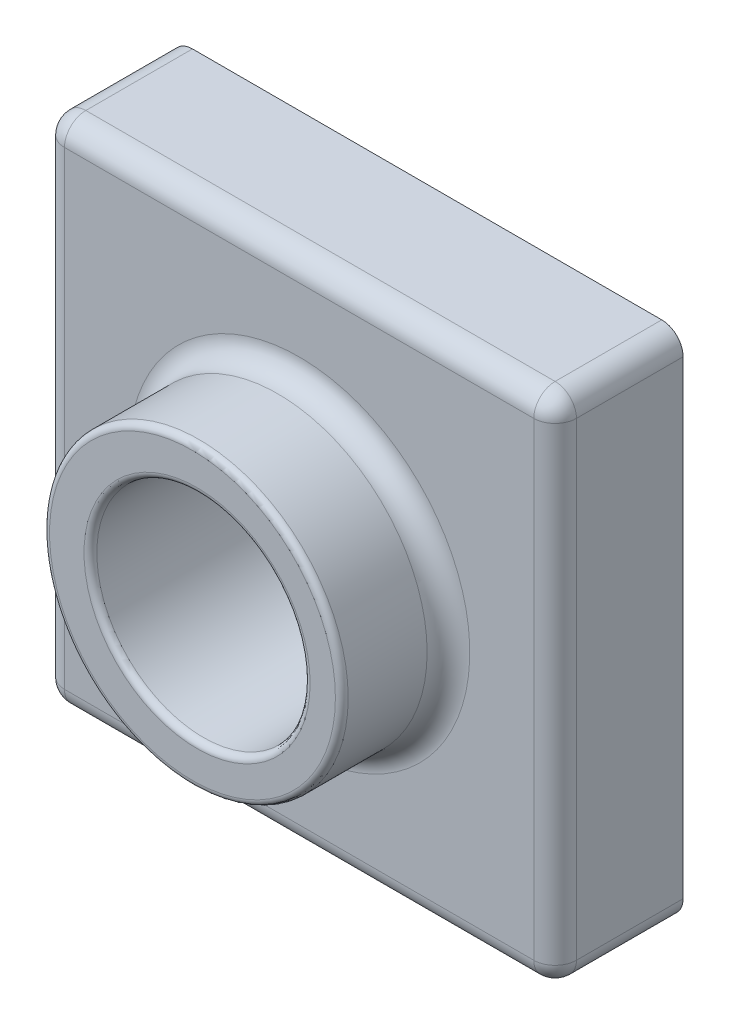
ISO-10303-21;
HEADER;
FILE_DESCRIPTION(('STEP AP214'),'2;1');
FILE_NAME('part.step','',(''),(''),'','','');
FILE_SCHEMA(('AUTOMOTIVE_DESIGN { 1 0 10303 214 1 1 1 1 }'));
ENDSEC;
DATA;
#1=APPLICATION_CONTEXT('core data for automotive mechanical design processes');
#2=APPLICATION_PROTOCOL_DEFINITION('international standard','automotive_design',2000,#1);
#3=PRODUCT_CONTEXT('',#1,'mechanical');
#4=PRODUCT('Part','Part','',(#3));
#5=PRODUCT_RELATED_PRODUCT_CATEGORY('part','',(#4));
#6=PRODUCT_DEFINITION_FORMATION('','',#4);
#7=PRODUCT_DEFINITION_CONTEXT('part definition',#1,'design');
#8=PRODUCT_DEFINITION('design','',#6,#7);
#9=PRODUCT_DEFINITION_SHAPE('','',#8);
#10=(LENGTH_UNIT() NAMED_UNIT(*) SI_UNIT(.MILLI.,.METRE.));
#11=(NAMED_UNIT(*) PLANE_ANGLE_UNIT() SI_UNIT($,.RADIAN.));
#12=(NAMED_UNIT(*) SI_UNIT($,.STERADIAN.) SOLID_ANGLE_UNIT());
#13=UNCERTAINTY_MEASURE_WITH_UNIT(LENGTH_MEASURE(1.E-05),#10,'distance_accuracy_value','');
#14=(GEOMETRIC_REPRESENTATION_CONTEXT(3) GLOBAL_UNCERTAINTY_ASSIGNED_CONTEXT((#13)) GLOBAL_UNIT_ASSIGNED_CONTEXT((#10,
#11,#12)) REPRESENTATION_CONTEXT('',''));
#15=CARTESIAN_POINT('',(0.,0.,0.));
#16=DIRECTION('',(0.,0.,1.));
#17=DIRECTION('',(1.,0.,0.));
#18=AXIS2_PLACEMENT_3D('',#15,#16,#17);
#19=CARTESIAN_POINT('',(0.,0.,0.));
#20=DIRECTION('',(0.,0.,-1.));
#21=DIRECTION('',(-1.,0.,0.));
#22=AXIS2_PLACEMENT_3D('',#19,#20,#21);
#23=PLANE('',#22);
#24=DIRECTION('',(0.,1.,0.));
#25=VECTOR('',#24,1.);
#26=CARTESIAN_POINT('',(120.,0.,0.));
#27=LINE('',#26,#25);
#28=CARTESIAN_POINT('',(120.,5.,0.));
#29=VERTEX_POINT('',#28);
#30=CARTESIAN_POINT('',(120.,115.,0.));
#31=VERTEX_POINT('',#30);
#32=EDGE_CURVE('E289',#29,#31,#27,.T.);
#33=ORIENTED_EDGE('',*,*,#32,.F.);
#34=CARTESIAN_POINT('',(115.,5.,0.));
#35=DIRECTION('',(0.,0.,-1.));
#36=DIRECTION('',(-1.,0.,0.));
#37=AXIS2_PLACEMENT_3D('',#34,#35,#36);
#38=CIRCLE('',#37,5.);
#39=CARTESIAN_POINT('',(115.,0.,0.));
#40=VERTEX_POINT('',#39);
#41=EDGE_CURVE('E372',#29,#40,#38,.T.);
#42=ORIENTED_EDGE('',*,*,#41,.T.);
#43=DIRECTION('',(1.,0.,0.));
#44=VECTOR('',#43,1.);
#45=CARTESIAN_POINT('',(0.,0.,0.));
#46=LINE('',#45,#44);
#47=CARTESIAN_POINT('',(5.,0.,0.));
#48=VERTEX_POINT('',#47);
#49=EDGE_CURVE('E302',#48,#40,#46,.T.);
#50=ORIENTED_EDGE('',*,*,#49,.F.);
#51=CARTESIAN_POINT('',(5.,5.,0.));
#52=DIRECTION('',(0.,0.,-1.));
#53=DIRECTION('',(-1.,0.,0.));
#54=AXIS2_PLACEMENT_3D('',#51,#52,#53);
#55=CIRCLE('',#54,5.);
#56=CARTESIAN_POINT('',(0.,5.,0.));
#57=VERTEX_POINT('',#56);
#58=EDGE_CURVE('E363',#48,#57,#55,.T.);
#59=ORIENTED_EDGE('',*,*,#58,.T.);
#60=DIRECTION('',(0.,-1.,0.));
#61=VECTOR('',#60,1.);
#62=CARTESIAN_POINT('',(0.,0.,0.));
#63=LINE('',#62,#61);
#64=CARTESIAN_POINT('',(0.,115.,0.));
#65=VERTEX_POINT('',#64);
#66=EDGE_CURVE('E298',#65,#57,#63,.T.);
#67=ORIENTED_EDGE('',*,*,#66,.F.);
#68=CARTESIAN_POINT('',(4.99999999999996,115.,0.));
#69=DIRECTION('',(0.,0.,-1.));
#70=DIRECTION('',(-1.,0.,0.));
#71=AXIS2_PLACEMENT_3D('',#68,#69,#70);
#72=CIRCLE('',#71,5.);
#73=CARTESIAN_POINT('',(4.99999999999996,120.,0.));
#74=VERTEX_POINT('',#73);
#75=EDGE_CURVE('E366',#65,#74,#72,.T.);
#76=ORIENTED_EDGE('',*,*,#75,.T.);
#77=DIRECTION('',(-1.,0.,0.));
#78=VECTOR('',#77,1.);
#79=CARTESIAN_POINT('',(0.,120.,0.));
#80=LINE('',#79,#78);
#81=CARTESIAN_POINT('',(115.,120.,0.));
#82=VERTEX_POINT('',#81);
#83=EDGE_CURVE('E294',#82,#74,#80,.T.);
#84=ORIENTED_EDGE('',*,*,#83,.F.);
#85=CARTESIAN_POINT('',(115.,115.,0.));
#86=DIRECTION('',(0.,0.,-1.));
#87=DIRECTION('',(-1.,0.,0.));
#88=AXIS2_PLACEMENT_3D('',#85,#86,#87);
#89=CIRCLE('',#88,5.);
#90=EDGE_CURVE('E369',#82,#31,#89,.T.);
#91=ORIENTED_EDGE('',*,*,#90,.T.);
#92=EDGE_LOOP('',(#33,#42,#50,#59,#67,#76,#84,#91));
#93=FACE_BOUND('',#92,.T.);
#94=CARTESIAN_POINT('',(115.,5.,0.));
#95=DIRECTION('',(0.,0.,-1.));
#96=DIRECTION('',(-1.,0.,0.));
#97=AXIS2_PLACEMENT_3D('',#94,#95,#96);
#98=CIRCLE('',#97,3.);
#99=CARTESIAN_POINT('',(118.,5.,0.));
#100=VERTEX_POINT('',#99);
#101=CARTESIAN_POINT('',(115.,2.,0.));
#102=VERTEX_POINT('',#101);
#103=EDGE_CURVE('E252',#100,#102,#98,.T.);
#104=ORIENTED_EDGE('',*,*,#103,.F.);
#105=DIRECTION('',(0.,1.,0.));
#106=VECTOR('',#105,1.);
#107=CARTESIAN_POINT('',(118.,0.,0.));
#108=LINE('',#107,#106);
#109=CARTESIAN_POINT('',(118.,115.,0.));
#110=VERTEX_POINT('',#109);
#111=EDGE_CURVE('E196',#100,#110,#108,.T.);
#112=ORIENTED_EDGE('',*,*,#111,.T.);
#113=CARTESIAN_POINT('',(115.,115.,0.));
#114=DIRECTION('',(0.,0.,-1.));
#115=DIRECTION('',(-1.,0.,0.));
#116=AXIS2_PLACEMENT_3D('',#113,#114,#115);
#117=CIRCLE('',#116,3.);
#118=CARTESIAN_POINT('',(115.,118.,0.));
#119=VERTEX_POINT('',#118);
#120=EDGE_CURVE('E262',#119,#110,#117,.T.);
#121=ORIENTED_EDGE('',*,*,#120,.F.);
#122=DIRECTION('',(-1.,0.,0.));
#123=VECTOR('',#122,1.);
#124=CARTESIAN_POINT('',(0.,118.,0.));
#125=LINE('',#124,#123);
#126=CARTESIAN_POINT('',(4.99999999999996,118.,0.));
#127=VERTEX_POINT('',#126);
#128=EDGE_CURVE('E54',#119,#127,#125,.T.);
#129=ORIENTED_EDGE('',*,*,#128,.T.);
#130=CARTESIAN_POINT('',(4.99999999999996,115.,0.));
#131=DIRECTION('',(0.,0.,-1.));
#132=DIRECTION('',(-1.,0.,0.));
#133=AXIS2_PLACEMENT_3D('',#130,#131,#132);
#134=CIRCLE('',#133,3.);
#135=CARTESIAN_POINT('',(1.99999999999996,115.,0.));
#136=VERTEX_POINT('',#135);
#137=EDGE_CURVE('E271',#136,#127,#134,.T.);
#138=ORIENTED_EDGE('',*,*,#137,.F.);
#139=DIRECTION('',(0.,-1.,0.));
#140=VECTOR('',#139,1.);
#141=CARTESIAN_POINT('',(2.,0.,0.));
#142=LINE('',#141,#140);
#143=CARTESIAN_POINT('',(2.,5.,0.));
#144=VERTEX_POINT('',#143);
#145=EDGE_CURVE('E268',#136,#144,#142,.T.);
#146=ORIENTED_EDGE('',*,*,#145,.T.);
#147=CARTESIAN_POINT('',(5.,5.,0.));
#148=DIRECTION('',(0.,0.,-1.));
#149=DIRECTION('',(-1.,0.,0.));
#150=AXIS2_PLACEMENT_3D('',#147,#148,#149);
#151=CIRCLE('',#150,3.);
#152=CARTESIAN_POINT('',(5.,2.,0.));
#153=VERTEX_POINT('',#152);
#154=EDGE_CURVE('E246',#153,#144,#151,.T.);
#155=ORIENTED_EDGE('',*,*,#154,.F.);
#156=DIRECTION('',(1.,0.,0.));
#157=VECTOR('',#156,1.);
#158=CARTESIAN_POINT('',(0.,2.,0.));
#159=LINE('',#158,#157);
#160=EDGE_CURVE('E263',#153,#102,#159,.T.);
#161=ORIENTED_EDGE('',*,*,#160,.T.);
#162=EDGE_LOOP('',(#104,#112,#121,#129,#138,#146,#155,#161));
#163=FACE_BOUND('',#162,.T.);
#164=ADVANCED_FACE('F38',(#93,#163),#23,.T.);
#165=CARTESIAN_POINT('',(120.,0.,30.));
#166=DIRECTION('',(-1.,0.,0.));
#167=DIRECTION('',(0.,-1.,0.));
#168=AXIS2_PLACEMENT_3D('',#165,#166,#167);
#169=PLANE('',#168);
#170=DIRECTION('',(0.,1.,0.));
#171=VECTOR('',#170,1.);
#172=CARTESIAN_POINT('',(120.,0.,25.));
#173=LINE('',#172,#171);
#174=CARTESIAN_POINT('',(120.,115.,25.));
#175=VERTEX_POINT('',#174);
#176=CARTESIAN_POINT('',(120.,5.,25.));
#177=VERTEX_POINT('',#176);
#178=EDGE_CURVE('E62',#175,#177,#173,.F.);
#179=ORIENTED_EDGE('',*,*,#178,.T.);
#180=DIRECTION('',(0.,0.,-1.));
#181=VECTOR('',#180,1.);
#182=CARTESIAN_POINT('',(120.,5.,30.));
#183=LINE('',#182,#181);
#184=EDGE_CURVE('E356',#177,#29,#183,.T.);
#185=ORIENTED_EDGE('',*,*,#184,.T.);
#186=ORIENTED_EDGE('',*,*,#32,.T.);
#187=DIRECTION('',(0.,0.,-1.));
#188=VECTOR('',#187,1.);
#189=CARTESIAN_POINT('',(120.,115.,30.));
#190=LINE('',#189,#188);
#191=EDGE_CURVE('E351',#31,#175,#190,.F.);
#192=ORIENTED_EDGE('',*,*,#191,.T.);
#193=EDGE_LOOP('',(#179,#185,#186,#192));
#194=FACE_BOUND('',#193,.T.);
#195=ADVANCED_FACE('F472',(#194),#169,.F.);
#196=CARTESIAN_POINT('',(0.,120.,30.));
#197=DIRECTION('',(0.,-1.,0.));
#198=DIRECTION('',(0.,0.,-1.));
#199=AXIS2_PLACEMENT_3D('',#196,#197,#198);
#200=PLANE('',#199);
#201=DIRECTION('',(-1.,0.,0.));
#202=VECTOR('',#201,1.);
#203=CARTESIAN_POINT('',(0.,120.,25.));
#204=LINE('',#203,#202);
#205=CARTESIAN_POINT('',(4.99999999999996,120.,25.));
#206=VERTEX_POINT('',#205);
#207=CARTESIAN_POINT('',(115.,120.,25.));
#208=VERTEX_POINT('',#207);
#209=EDGE_CURVE('E345',#206,#208,#204,.F.);
#210=ORIENTED_EDGE('',*,*,#209,.T.);
#211=DIRECTION('',(0.,0.,-1.));
#212=VECTOR('',#211,1.);
#213=CARTESIAN_POINT('',(115.,120.,30.));
#214=LINE('',#213,#212);
#215=EDGE_CURVE('E348',#208,#82,#214,.T.);
#216=ORIENTED_EDGE('',*,*,#215,.T.);
#217=ORIENTED_EDGE('',*,*,#83,.T.);
#218=DIRECTION('',(0.,0.,-1.));
#219=VECTOR('',#218,1.);
#220=CARTESIAN_POINT('',(4.99999999999996,120.,30.));
#221=LINE('',#220,#219);
#222=EDGE_CURVE('E342',#74,#206,#221,.F.);
#223=ORIENTED_EDGE('',*,*,#222,.T.);
#224=EDGE_LOOP('',(#210,#216,#217,#223));
#225=FACE_BOUND('',#224,.T.);
#226=ADVANCED_FACE('F477',(#225),#200,.F.);
#227=CARTESIAN_POINT('',(0.,0.,30.));
#228=DIRECTION('',(1.,0.,0.));
#229=DIRECTION('',(0.,1.,0.));
#230=AXIS2_PLACEMENT_3D('',#227,#228,#229);
#231=PLANE('',#230);
#232=DIRECTION('',(0.,-1.,0.));
#233=VECTOR('',#232,1.);
#234=CARTESIAN_POINT('',(0.,0.,25.));
#235=LINE('',#234,#233);
#236=CARTESIAN_POINT('',(0.,5.,25.));
#237=VERTEX_POINT('',#236);
#238=CARTESIAN_POINT('',(0.,115.,25.));
#239=VERTEX_POINT('',#238);
#240=EDGE_CURVE('E336',#237,#239,#235,.F.);
#241=ORIENTED_EDGE('',*,*,#240,.T.);
#242=DIRECTION('',(0.,0.,-1.));
#243=VECTOR('',#242,1.);
#244=CARTESIAN_POINT('',(0.,115.,30.));
#245=LINE('',#244,#243);
#246=EDGE_CURVE('E339',#239,#65,#245,.T.);
#247=ORIENTED_EDGE('',*,*,#246,.T.);
#248=ORIENTED_EDGE('',*,*,#66,.T.);
#249=DIRECTION('',(0.,0.,-1.));
#250=VECTOR('',#249,1.);
#251=CARTESIAN_POINT('',(0.,5.,30.));
#252=LINE('',#251,#250);
#253=EDGE_CURVE('E333',#57,#237,#252,.F.);
#254=ORIENTED_EDGE('',*,*,#253,.T.);
#255=EDGE_LOOP('',(#241,#247,#248,#254));
#256=FACE_BOUND('',#255,.T.);
#257=ADVANCED_FACE('F905',(#256),#231,.F.);
#258=CARTESIAN_POINT('',(0.,0.,30.));
#259=DIRECTION('',(0.,1.,0.));
#260=DIRECTION('',(0.,0.,1.));
#261=AXIS2_PLACEMENT_3D('',#258,#259,#260);
#262=PLANE('',#261);
#263=ORIENTED_EDGE('',*,*,#49,.T.);
#264=DIRECTION('',(0.,0.,-1.));
#265=VECTOR('',#264,1.);
#266=CARTESIAN_POINT('',(115.,0.,30.));
#267=LINE('',#266,#265);
#268=CARTESIAN_POINT('',(115.,0.,25.));
#269=VERTEX_POINT('',#268);
#270=EDGE_CURVE('E330',#40,#269,#267,.F.);
#271=ORIENTED_EDGE('',*,*,#270,.T.);
#272=DIRECTION('',(1.,0.,0.));
#273=VECTOR('',#272,1.);
#274=CARTESIAN_POINT('',(0.,0.,25.));
#275=LINE('',#274,#273);
#276=CARTESIAN_POINT('',(5.,0.,25.));
#277=VERTEX_POINT('',#276);
#278=EDGE_CURVE('E326',#269,#277,#275,.F.);
#279=ORIENTED_EDGE('',*,*,#278,.T.);
#280=DIRECTION('',(0.,0.,-1.));
#281=VECTOR('',#280,1.);
#282=CARTESIAN_POINT('',(5.,0.,30.));
#283=LINE('',#282,#281);
#284=EDGE_CURVE('E323',#277,#48,#283,.T.);
#285=ORIENTED_EDGE('',*,*,#284,.T.);
#286=EDGE_LOOP('',(#263,#271,#279,#285));
#287=FACE_BOUND('',#286,.T.);
#288=ADVANCED_FACE('F466',(#287),#262,.F.);
#289=CARTESIAN_POINT('',(0.,0.,30.));
#290=DIRECTION('',(0.,0.,-1.));
#291=DIRECTION('',(-1.,0.,0.));
#292=AXIS2_PLACEMENT_3D('',#289,#290,#291);
#293=PLANE('',#292);
#294=DIRECTION('',(0.,-1.,0.));
#295=VECTOR('',#294,1.);
#296=CARTESIAN_POINT('',(5.,0.,30.));
#297=LINE('',#296,#295);
#298=CARTESIAN_POINT('',(4.99999999999996,115.,30.));
#299=VERTEX_POINT('',#298);
#300=CARTESIAN_POINT('',(5.,5.,30.));
#301=VERTEX_POINT('',#300);
#302=EDGE_CURVE('E316',#299,#301,#297,.T.);
#303=ORIENTED_EDGE('',*,*,#302,.T.);
#304=DIRECTION('',(1.,0.,0.));
#305=VECTOR('',#304,1.);
#306=CARTESIAN_POINT('',(0.,5.,30.));
#307=LINE('',#306,#305);
#308=CARTESIAN_POINT('',(115.,5.,30.));
#309=VERTEX_POINT('',#308);
#310=EDGE_CURVE('E319',#301,#309,#307,.T.);
#311=ORIENTED_EDGE('',*,*,#310,.T.);
#312=DIRECTION('',(0.,1.,0.));
#313=VECTOR('',#312,1.);
#314=CARTESIAN_POINT('',(115.,0.,30.));
#315=LINE('',#314,#313);
#316=CARTESIAN_POINT('',(115.,115.,30.));
#317=VERTEX_POINT('',#316);
#318=EDGE_CURVE('E310',#309,#317,#315,.T.);
#319=ORIENTED_EDGE('',*,*,#318,.T.);
#320=DIRECTION('',(-1.,0.,0.));
#321=VECTOR('',#320,1.);
#322=CARTESIAN_POINT('',(0.,115.,30.));
#323=LINE('',#322,#321);
#324=EDGE_CURVE('E313',#317,#299,#323,.T.);
#325=ORIENTED_EDGE('',*,*,#324,.T.);
#326=EDGE_LOOP('',(#303,#311,#319,#325));
#327=FACE_BOUND('',#326,.T.);
#328=CARTESIAN_POINT('',(60.,60.,30.));
#329=DIRECTION('',(0.,0.,-1.));
#330=DIRECTION('',(-1.,0.,0.));
#331=AXIS2_PLACEMENT_3D('',#328,#329,#330);
#332=CIRCLE('',#331,40.);
#333=CARTESIAN_POINT('',(20.,60.,30.));
#334=VERTEX_POINT('',#333);
#335=EDGE_CURVE('E306',#334,#334,#332,.T.);
#336=ORIENTED_EDGE('',*,*,#335,.T.);
#337=EDGE_LOOP('',(#336));
#338=FACE_BOUND('',#337,.T.);
#339=ADVANCED_FACE('F458',(#327,#338),#293,.F.);
#340=CARTESIAN_POINT('',(61.077689107155,60.,0.));
#341=DIRECTION('',(0.,0.,-1.));
#342=DIRECTION('',(-1.,0.,0.));
#343=AXIS2_PLACEMENT_3D('',#340,#341,#342);
#344=CIRCLE('',#343,27.);
#345=CARTESIAN_POINT('',(34.077689107155,60.,0.));
#346=VERTEX_POINT('',#345);
#347=EDGE_CURVE('E259',#346,#346,#344,.F.);
#348=ORIENTED_EDGE('',*,*,#347,.F.);
#349=EDGE_LOOP('',(#348));
#350=FACE_BOUND('',#349,.T.);
#351=CARTESIAN_POINT('',(61.077689107155,60.,0.));
#352=DIRECTION('',(0.,0.,1.));
#353=DIRECTION('',(1.,0.,0.));
#354=AXIS2_PLACEMENT_3D('',#351,#352,#353);
#355=CIRCLE('',#354,25.);
#356=CARTESIAN_POINT('',(86.077689107155,60.,0.));
#357=VERTEX_POINT('',#356);
#358=EDGE_CURVE('E285',#357,#357,#355,.T.);
#359=ORIENTED_EDGE('',*,*,#358,.T.);
#360=EDGE_LOOP('',(#359));
#361=FACE_BOUND('',#360,.T.);
#362=ADVANCED_FACE('F456',(#350,#361),#23,.T.);
#363=CARTESIAN_POINT('',(60.,60.,55.));
#364=DIRECTION('',(0.,0.,-1.));
#365=DIRECTION('',(-1.,0.,0.));
#366=AXIS2_PLACEMENT_3D('',#363,#364,#365);
#367=CYLINDRICAL_SURFACE('',#366,35.);
#368=CARTESIAN_POINT('',(60.,60.,53.5));
#369=DIRECTION('',(0.,0.,1.));
#370=DIRECTION('',(1.,0.,0.));
#371=AXIS2_PLACEMENT_3D('',#368,#369,#370);
#372=CIRCLE('',#371,35.);
#373=CARTESIAN_POINT('',(95.,60.,53.5));
#374=VERTEX_POINT('',#373);
#375=EDGE_CURVE('E47',#374,#374,#372,.F.);
#376=ORIENTED_EDGE('',*,*,#375,.T.);
#377=EDGE_LOOP('',(#376));
#378=FACE_BOUND('',#377,.T.);
#379=CARTESIAN_POINT('',(60.,60.,35.));
#380=DIRECTION('',(0.,0.,-1.));
#381=DIRECTION('',(-1.,0.,0.));
#382=AXIS2_PLACEMENT_3D('',#379,#380,#381);
#383=CIRCLE('',#382,35.);
#384=CARTESIAN_POINT('',(25.,60.,35.));
#385=VERTEX_POINT('',#384);
#386=EDGE_CURVE('E359',#385,#385,#383,.F.);
#387=ORIENTED_EDGE('',*,*,#386,.T.);
#388=EDGE_LOOP('',(#387));
#389=FACE_BOUND('',#388,.T.);
#390=ADVANCED_FACE('F430',(#378,#389),#367,.T.);
#391=CARTESIAN_POINT('',(60.,60.,55.));
#392=DIRECTION('',(0.,0.,1.));
#393=DIRECTION('',(1.,0.,0.));
#394=AXIS2_PLACEMENT_3D('',#391,#392,#393);
#395=PLANE('',#394);
#396=CARTESIAN_POINT('',(60.,60.,55.));
#397=DIRECTION('',(0.,0.,1.));
#398=DIRECTION('',(1.,0.,0.));
#399=AXIS2_PLACEMENT_3D('',#396,#397,#398);
#400=CIRCLE('',#399,33.5);
#401=CARTESIAN_POINT('',(93.5,60.,55.));
#402=VERTEX_POINT('',#401);
#403=EDGE_CURVE('E423',#402,#402,#400,.T.);
#404=ORIENTED_EDGE('',*,*,#403,.T.);
#405=EDGE_LOOP('',(#404));
#406=FACE_BOUND('',#405,.T.);
#407=CARTESIAN_POINT('',(61.077689107155,60.,55.));
#408=DIRECTION('',(0.,0.,1.));
#409=DIRECTION('',(1.,0.,0.));
#410=AXIS2_PLACEMENT_3D('',#407,#408,#409);
#411=CIRCLE('',#410,26.5);
#412=CARTESIAN_POINT('',(87.577689107155,60.,55.));
#413=VERTEX_POINT('',#412);
#414=EDGE_CURVE('E375',#413,#413,#411,.F.);
#415=ORIENTED_EDGE('',*,*,#414,.T.);
#416=EDGE_LOOP('',(#415));
#417=FACE_BOUND('',#416,.T.);
#418=ADVANCED_FACE('F439',(#406,#417),#395,.T.);
#419=CARTESIAN_POINT('',(61.077689107155,60.,0.));
#420=DIRECTION('',(0.,0.,1.));
#421=DIRECTION('',(1.,0.,0.));
#422=AXIS2_PLACEMENT_3D('',#419,#420,#421);
#423=CYLINDRICAL_SURFACE('',#422,25.);
#424=CARTESIAN_POINT('',(61.077689107155,60.,53.5));
#425=DIRECTION('',(0.,0.,1.));
#426=DIRECTION('',(1.,0.,0.));
#427=AXIS2_PLACEMENT_3D('',#424,#425,#426);
#428=CIRCLE('',#427,25.);
#429=CARTESIAN_POINT('',(86.077689107155,60.,53.5));
#430=VERTEX_POINT('',#429);
#431=EDGE_CURVE('E11',#430,#430,#428,.T.);
#432=ORIENTED_EDGE('',*,*,#431,.T.);
#433=EDGE_LOOP('',(#432));
#434=FACE_BOUND('',#433,.T.);
#435=ORIENTED_EDGE('',*,*,#358,.F.);
#436=EDGE_LOOP('',(#435));
#437=FACE_BOUND('',#436,.T.);
#438=ADVANCED_FACE('F442',(#434,#437),#423,.F.);
#439=CARTESIAN_POINT('',(4.99999999999996,115.,30.));
#440=DIRECTION('',(0.,0.,-1.));
#441=DIRECTION('',(-1.,0.,0.));
#442=AXIS2_PLACEMENT_3D('',#439,#440,#441);
#443=CYLINDRICAL_SURFACE('',#442,5.);
#444=ORIENTED_EDGE('',*,*,#75,.F.);
#445=ORIENTED_EDGE('',*,*,#246,.F.);
#446=CARTESIAN_POINT('',(4.99999999999996,115.,25.));
#447=DIRECTION('',(0.,0.,1.));
#448=DIRECTION('',(1.,0.,0.));
#449=AXIS2_PLACEMENT_3D('',#446,#447,#448);
#450=CIRCLE('',#449,5.);
#451=EDGE_CURVE('E290',#206,#239,#450,.T.);
#452=ORIENTED_EDGE('',*,*,#451,.F.);
#453=ORIENTED_EDGE('',*,*,#222,.F.);
#454=EDGE_LOOP('',(#444,#445,#452,#453));
#455=FACE_BOUND('',#454,.T.);
#456=ADVANCED_FACE('F452',(#455),#443,.T.);
#457=CARTESIAN_POINT('',(0.,115.,25.));
#458=DIRECTION('',(-1.,0.,0.));
#459=DIRECTION('',(0.,0.,1.));
#460=AXIS2_PLACEMENT_3D('',#457,#458,#459);
#461=CYLINDRICAL_SURFACE('',#460,5.);
#462=CARTESIAN_POINT('',(115.,115.,25.));
#463=DIRECTION('',(1.,0.,0.));
#464=DIRECTION('',(0.,0.,-1.));
#465=AXIS2_PLACEMENT_3D('',#462,#463,#464);
#466=CIRCLE('',#465,5.);
#467=EDGE_CURVE('E409',#208,#317,#466,.T.);
#468=ORIENTED_EDGE('',*,*,#467,.F.);
#469=ORIENTED_EDGE('',*,*,#209,.F.);
#470=CARTESIAN_POINT('',(4.99999999999996,115.,25.));
#471=DIRECTION('',(-1.,0.,0.));
#472=DIRECTION('',(0.,0.,1.));
#473=AXIS2_PLACEMENT_3D('',#470,#471,#472);
#474=CIRCLE('',#473,5.);
#475=EDGE_CURVE('E413',#299,#206,#474,.T.);
#476=ORIENTED_EDGE('',*,*,#475,.F.);
#477=ORIENTED_EDGE('',*,*,#324,.F.);
#478=EDGE_LOOP('',(#468,#469,#476,#477));
#479=FACE_BOUND('',#478,.T.);
#480=ADVANCED_FACE('F858',(#479),#461,.T.);
#481=CARTESIAN_POINT('',(115.,115.,30.));
#482=DIRECTION('',(0.,0.,-1.));
#483=DIRECTION('',(-1.,0.,0.));
#484=AXIS2_PLACEMENT_3D('',#481,#482,#483);
#485=CYLINDRICAL_SURFACE('',#484,5.);
#486=ORIENTED_EDGE('',*,*,#90,.F.);
#487=ORIENTED_EDGE('',*,*,#215,.F.);
#488=CARTESIAN_POINT('',(115.,115.,25.));
#489=DIRECTION('',(0.,0.,1.));
#490=DIRECTION('',(1.,0.,0.));
#491=AXIS2_PLACEMENT_3D('',#488,#489,#490);
#492=CIRCLE('',#491,5.);
#493=EDGE_CURVE('E405',#175,#208,#492,.T.);
#494=ORIENTED_EDGE('',*,*,#493,.F.);
#495=ORIENTED_EDGE('',*,*,#191,.F.);
#496=EDGE_LOOP('',(#486,#487,#494,#495));
#497=FACE_BOUND('',#496,.T.);
#498=ADVANCED_FACE('F849',(#497),#485,.T.);
#499=CARTESIAN_POINT('',(4.99999999999996,115.,25.));
#500=DIRECTION('',(0.,0.,1.));
#501=DIRECTION('',(1.,0.,0.));
#502=AXIS2_PLACEMENT_3D('',#499,#500,#501);
#503=SPHERICAL_SURFACE('',#502,5.);
#504=ORIENTED_EDGE('',*,*,#475,.T.);
#505=ORIENTED_EDGE('',*,*,#451,.T.);
#506=CARTESIAN_POINT('',(4.99999999999996,115.,25.));
#507=DIRECTION('',(0.,1.,0.));
#508=DIRECTION('',(0.,0.,1.));
#509=AXIS2_PLACEMENT_3D('',#506,#507,#508);
#510=CIRCLE('',#509,5.);
#511=EDGE_CURVE('E401',#299,#239,#510,.F.);
#512=ORIENTED_EDGE('',*,*,#511,.F.);
#513=EDGE_LOOP('',(#504,#505,#512));
#514=FACE_BOUND('',#513,.T.);
#515=ADVANCED_FACE('F840',(#514),#503,.T.);
#516=CARTESIAN_POINT('',(115.,115.,25.));
#517=DIRECTION('',(0.,0.,1.));
#518=DIRECTION('',(1.,0.,0.));
#519=AXIS2_PLACEMENT_3D('',#516,#517,#518);
#520=SPHERICAL_SURFACE('',#519,5.);
#521=ORIENTED_EDGE('',*,*,#493,.T.);
#522=ORIENTED_EDGE('',*,*,#467,.T.);
#523=CARTESIAN_POINT('',(115.,115.,25.));
#524=DIRECTION('',(0.,1.,0.));
#525=DIRECTION('',(0.,0.,1.));
#526=AXIS2_PLACEMENT_3D('',#523,#524,#525);
#527=CIRCLE('',#526,5.);
#528=EDGE_CURVE('E397',#175,#317,#527,.F.);
#529=ORIENTED_EDGE('',*,*,#528,.F.);
#530=EDGE_LOOP('',(#521,#522,#529));
#531=FACE_BOUND('',#530,.T.);
#532=ADVANCED_FACE('F831',(#531),#520,.T.);
#533=CARTESIAN_POINT('',(5.,5.,30.));
#534=DIRECTION('',(0.,0.,-1.));
#535=DIRECTION('',(-1.,0.,0.));
#536=AXIS2_PLACEMENT_3D('',#533,#534,#535);
#537=CYLINDRICAL_SURFACE('',#536,5.);
#538=ORIENTED_EDGE('',*,*,#58,.F.);
#539=ORIENTED_EDGE('',*,*,#284,.F.);
#540=CARTESIAN_POINT('',(5.,5.,25.));
#541=DIRECTION('',(0.,0.,1.));
#542=DIRECTION('',(1.,0.,0.));
#543=AXIS2_PLACEMENT_3D('',#540,#541,#542);
#544=CIRCLE('',#543,5.);
#545=EDGE_CURVE('E393',#237,#277,#544,.T.);
#546=ORIENTED_EDGE('',*,*,#545,.F.);
#547=ORIENTED_EDGE('',*,*,#253,.F.);
#548=EDGE_LOOP('',(#538,#539,#546,#547));
#549=FACE_BOUND('',#548,.T.);
#550=ADVANCED_FACE('F822',(#549),#537,.T.);
#551=CARTESIAN_POINT('',(5.,0.,25.));
#552=DIRECTION('',(0.,-1.,0.));
#553=DIRECTION('',(1.,0.,0.));
#554=AXIS2_PLACEMENT_3D('',#551,#552,#553);
#555=CYLINDRICAL_SURFACE('',#554,5.);
#556=ORIENTED_EDGE('',*,*,#511,.T.);
#557=ORIENTED_EDGE('',*,*,#240,.F.);
#558=CARTESIAN_POINT('',(5.,5.,25.));
#559=DIRECTION('',(0.,-1.,0.));
#560=DIRECTION('',(1.,0.,0.));
#561=AXIS2_PLACEMENT_3D('',#558,#559,#560);
#562=CIRCLE('',#561,5.);
#563=EDGE_CURVE('E389',#301,#237,#562,.T.);
#564=ORIENTED_EDGE('',*,*,#563,.F.);
#565=ORIENTED_EDGE('',*,*,#302,.F.);
#566=EDGE_LOOP('',(#556,#557,#564,#565));
#567=FACE_BOUND('',#566,.T.);
#568=ADVANCED_FACE('F813',(#567),#555,.T.);
#569=CARTESIAN_POINT('',(115.,0.,25.));
#570=DIRECTION('',(0.,1.,0.));
#571=DIRECTION('',(-1.,0.,0.));
#572=AXIS2_PLACEMENT_3D('',#569,#570,#571);
#573=CYLINDRICAL_SURFACE('',#572,5.);
#574=ORIENTED_EDGE('',*,*,#528,.T.);
#575=ORIENTED_EDGE('',*,*,#318,.F.);
#576=CARTESIAN_POINT('',(115.,5.,25.));
#577=DIRECTION('',(0.,-1.,0.));
#578=DIRECTION('',(1.,0.,0.));
#579=AXIS2_PLACEMENT_3D('',#576,#577,#578);
#580=CIRCLE('',#579,5.);
#581=EDGE_CURVE('E385',#177,#309,#580,.T.);
#582=ORIENTED_EDGE('',*,*,#581,.F.);
#583=ORIENTED_EDGE('',*,*,#178,.F.);
#584=EDGE_LOOP('',(#574,#575,#582,#583));
#585=FACE_BOUND('',#584,.T.);
#586=ADVANCED_FACE('F804',(#585),#573,.T.);
#587=CARTESIAN_POINT('',(115.,5.,30.));
#588=DIRECTION('',(0.,0.,-1.));
#589=DIRECTION('',(-1.,0.,0.));
#590=AXIS2_PLACEMENT_3D('',#587,#588,#589);
#591=CYLINDRICAL_SURFACE('',#590,5.);
#592=ORIENTED_EDGE('',*,*,#41,.F.);
#593=ORIENTED_EDGE('',*,*,#184,.F.);
#594=CARTESIAN_POINT('',(115.,5.,25.));
#595=DIRECTION('',(0.,0.,1.));
#596=DIRECTION('',(1.,0.,0.));
#597=AXIS2_PLACEMENT_3D('',#594,#595,#596);
#598=CIRCLE('',#597,5.);
#599=EDGE_CURVE('E381',#269,#177,#598,.T.);
#600=ORIENTED_EDGE('',*,*,#599,.F.);
#601=ORIENTED_EDGE('',*,*,#270,.F.);
#602=EDGE_LOOP('',(#592,#593,#600,#601));
#603=FACE_BOUND('',#602,.T.);
#604=ADVANCED_FACE('F795',(#603),#591,.T.);
#605=CARTESIAN_POINT('',(5.,5.,25.));
#606=DIRECTION('',(0.,0.,1.));
#607=DIRECTION('',(1.,0.,0.));
#608=AXIS2_PLACEMENT_3D('',#605,#606,#607);
#609=SPHERICAL_SURFACE('',#608,5.);
#610=ORIENTED_EDGE('',*,*,#563,.T.);
#611=ORIENTED_EDGE('',*,*,#545,.T.);
#612=CARTESIAN_POINT('',(5.,5.,25.));
#613=DIRECTION('',(-1.,0.,0.));
#614=DIRECTION('',(0.,0.,1.));
#615=AXIS2_PLACEMENT_3D('',#612,#613,#614);
#616=CIRCLE('',#615,5.);
#617=EDGE_CURVE('E378',#301,#277,#616,.F.);
#618=ORIENTED_EDGE('',*,*,#617,.F.);
#619=EDGE_LOOP('',(#610,#611,#618));
#620=FACE_BOUND('',#619,.T.);
#621=ADVANCED_FACE('F786',(#620),#609,.T.);
#622=CARTESIAN_POINT('',(115.,5.,25.));
#623=DIRECTION('',(0.,0.,1.));
#624=DIRECTION('',(1.,0.,0.));
#625=AXIS2_PLACEMENT_3D('',#622,#623,#624);
#626=SPHERICAL_SURFACE('',#625,5.);
#627=ORIENTED_EDGE('',*,*,#599,.T.);
#628=ORIENTED_EDGE('',*,*,#581,.T.);
#629=CARTESIAN_POINT('',(115.,5.,25.));
#630=DIRECTION('',(1.,0.,0.));
#631=DIRECTION('',(0.,0.,-1.));
#632=AXIS2_PLACEMENT_3D('',#629,#630,#631);
#633=CIRCLE('',#632,5.);
#634=EDGE_CURVE('E256',#269,#309,#633,.F.);
#635=ORIENTED_EDGE('',*,*,#634,.F.);
#636=EDGE_LOOP('',(#627,#628,#635));
#637=FACE_BOUND('',#636,.T.);
#638=ADVANCED_FACE('F777',(#637),#626,.T.);
#639=CARTESIAN_POINT('',(0.,5.,25.));
#640=DIRECTION('',(1.,0.,0.));
#641=DIRECTION('',(0.,0.,-1.));
#642=AXIS2_PLACEMENT_3D('',#639,#640,#641);
#643=CYLINDRICAL_SURFACE('',#642,5.);
#644=ORIENTED_EDGE('',*,*,#617,.T.);
#645=ORIENTED_EDGE('',*,*,#278,.F.);
#646=ORIENTED_EDGE('',*,*,#634,.T.);
#647=ORIENTED_EDGE('',*,*,#310,.F.);
#648=EDGE_LOOP('',(#644,#645,#646,#647));
#649=FACE_BOUND('',#648,.T.);
#650=ADVANCED_FACE('F767',(#649),#643,.T.);
#651=CARTESIAN_POINT('',(60.,60.,35.));
#652=DIRECTION('',(0.,0.,-1.));
#653=DIRECTION('',(-1.,0.,0.));
#654=AXIS2_PLACEMENT_3D('',#651,#652,#653);
#655=TOROIDAL_SURFACE('',#654,40.,5.);
#656=ORIENTED_EDGE('',*,*,#335,.F.);
#657=EDGE_LOOP('',(#656));
#658=FACE_BOUND('',#657,.T.);
#659=ORIENTED_EDGE('',*,*,#386,.F.);
#660=EDGE_LOOP('',(#659));
#661=FACE_BOUND('',#660,.T.);
#662=ADVANCED_FACE('F436',(#658,#661),#655,.F.);
#663=CARTESIAN_POINT('',(60.,60.,53.5));
#664=DIRECTION('',(0.,0.,1.));
#665=DIRECTION('',(1.,0.,0.));
#666=AXIS2_PLACEMENT_3D('',#663,#664,#665);
#667=TOROIDAL_SURFACE('',#666,33.5,1.5);
#668=ORIENTED_EDGE('',*,*,#375,.F.);
#669=EDGE_LOOP('',(#668));
#670=FACE_BOUND('',#669,.T.);
#671=ORIENTED_EDGE('',*,*,#403,.F.);
#672=EDGE_LOOP('',(#671));
#673=FACE_BOUND('',#672,.T.);
#674=ADVANCED_FACE('F433',(#670,#673),#667,.T.);
#675=CARTESIAN_POINT('',(61.077689107155,60.,53.5));
#676=DIRECTION('',(0.,0.,1.));
#677=DIRECTION('',(1.,0.,0.));
#678=AXIS2_PLACEMENT_3D('',#675,#676,#677);
#679=TOROIDAL_SURFACE('',#678,26.5,1.5);
#680=ORIENTED_EDGE('',*,*,#414,.F.);
#681=EDGE_LOOP('',(#680));
#682=FACE_BOUND('',#681,.T.);
#683=ORIENTED_EDGE('',*,*,#431,.F.);
#684=EDGE_LOOP('',(#683));
#685=FACE_BOUND('',#684,.T.);
#686=ADVANCED_FACE('F40',(#682,#685),#679,.T.);
#687=CARTESIAN_POINT('',(118.,0.,30.));
#688=DIRECTION('',(-1.,0.,0.));
#689=DIRECTION('',(0.,-1.,0.));
#690=AXIS2_PLACEMENT_3D('',#687,#688,#689);
#691=PLANE('',#690);
#692=DIRECTION('',(0.,-1.,0.));
#693=VECTOR('',#692,1.);
#694=CARTESIAN_POINT('',(118.,0.,25.));
#695=LINE('',#694,#693);
#696=CARTESIAN_POINT('',(118.,115.,25.));
#697=VERTEX_POINT('',#696);
#698=CARTESIAN_POINT('',(118.,5.,25.));
#699=VERTEX_POINT('',#698);
#700=EDGE_CURVE('E179',#697,#699,#695,.T.);
#701=ORIENTED_EDGE('',*,*,#700,.F.);
#702=DIRECTION('',(0.,0.,1.));
#703=VECTOR('',#702,1.);
#704=CARTESIAN_POINT('',(118.,115.,30.));
#705=LINE('',#704,#703);
#706=EDGE_CURVE('E191',#110,#697,#705,.T.);
#707=ORIENTED_EDGE('',*,*,#706,.F.);
#708=ORIENTED_EDGE('',*,*,#111,.F.);
#709=DIRECTION('',(0.,0.,1.));
#710=VECTOR('',#709,1.);
#711=CARTESIAN_POINT('',(118.,5.,30.));
#712=LINE('',#711,#710);
#713=EDGE_CURVE('E190',#699,#100,#712,.F.);
#714=ORIENTED_EDGE('',*,*,#713,.F.);
#715=EDGE_LOOP('',(#701,#707,#708,#714));
#716=FACE_BOUND('',#715,.T.);
#717=ADVANCED_FACE('F194',(#716),#691,.T.);
#718=CARTESIAN_POINT('',(0.,118.,30.));
#719=DIRECTION('',(0.,-1.,0.));
#720=DIRECTION('',(0.,0.,-1.));
#721=AXIS2_PLACEMENT_3D('',#718,#719,#720);
#722=PLANE('',#721);
#723=DIRECTION('',(1.,0.,0.));
#724=VECTOR('',#723,1.);
#725=CARTESIAN_POINT('',(0.,118.,25.));
#726=LINE('',#725,#724);
#727=CARTESIAN_POINT('',(4.99999999999996,118.,25.));
#728=VERTEX_POINT('',#727);
#729=CARTESIAN_POINT('',(115.,118.,25.));
#730=VERTEX_POINT('',#729);
#731=EDGE_CURVE('E548',#728,#730,#726,.T.);
#732=ORIENTED_EDGE('',*,*,#731,.F.);
#733=DIRECTION('',(0.,0.,-1.));
#734=VECTOR('',#733,1.);
#735=CARTESIAN_POINT('',(4.99999999999996,118.,30.));
#736=LINE('',#735,#734);
#737=EDGE_CURVE('E545',#127,#728,#736,.F.);
#738=ORIENTED_EDGE('',*,*,#737,.F.);
#739=ORIENTED_EDGE('',*,*,#128,.F.);
#740=DIRECTION('',(0.,0.,-1.));
#741=VECTOR('',#740,1.);
#742=CARTESIAN_POINT('',(115.,118.,30.));
#743=LINE('',#742,#741);
#744=EDGE_CURVE('E550',#730,#119,#743,.T.);
#745=ORIENTED_EDGE('',*,*,#744,.F.);
#746=EDGE_LOOP('',(#732,#738,#739,#745));
#747=FACE_BOUND('',#746,.T.);
#748=ADVANCED_FACE('F562',(#747),#722,.T.);
#749=CARTESIAN_POINT('',(2.,0.,30.));
#750=DIRECTION('',(1.,0.,0.));
#751=DIRECTION('',(0.,1.,0.));
#752=AXIS2_PLACEMENT_3D('',#749,#750,#751);
#753=PLANE('',#752);
#754=DIRECTION('',(0.,1.,0.));
#755=VECTOR('',#754,1.);
#756=CARTESIAN_POINT('',(2.,0.,25.));
#757=LINE('',#756,#755);
#758=CARTESIAN_POINT('',(2.,5.,25.));
#759=VERTEX_POINT('',#758);
#760=CARTESIAN_POINT('',(1.99999999999996,115.,25.));
#761=VERTEX_POINT('',#760);
#762=EDGE_CURVE('E536',#759,#761,#757,.T.);
#763=ORIENTED_EDGE('',*,*,#762,.F.);
#764=DIRECTION('',(0.,0.,1.));
#765=VECTOR('',#764,1.);
#766=CARTESIAN_POINT('',(2.,5.,30.));
#767=LINE('',#766,#765);
#768=EDGE_CURVE('E225',#144,#759,#767,.T.);
#769=ORIENTED_EDGE('',*,*,#768,.F.);
#770=ORIENTED_EDGE('',*,*,#145,.F.);
#771=DIRECTION('',(0.,0.,1.));
#772=VECTOR('',#771,1.);
#773=CARTESIAN_POINT('',(1.99999999999996,115.,30.));
#774=LINE('',#773,#772);
#775=EDGE_CURVE('E539',#761,#136,#774,.F.);
#776=ORIENTED_EDGE('',*,*,#775,.F.);
#777=EDGE_LOOP('',(#763,#769,#770,#776));
#778=FACE_BOUND('',#777,.T.);
#779=ADVANCED_FACE('F571',(#778),#753,.T.);
#780=CARTESIAN_POINT('',(0.,2.,30.));
#781=DIRECTION('',(0.,1.,0.));
#782=DIRECTION('',(0.,0.,1.));
#783=AXIS2_PLACEMENT_3D('',#780,#781,#782);
#784=PLANE('',#783);
#785=ORIENTED_EDGE('',*,*,#160,.F.);
#786=DIRECTION('',(0.,0.,1.));
#787=VECTOR('',#786,1.);
#788=CARTESIAN_POINT('',(5.,2.,30.));
#789=LINE('',#788,#787);
#790=CARTESIAN_POINT('',(5.,2.,25.));
#791=VERTEX_POINT('',#790);
#792=EDGE_CURVE('E230',#791,#153,#789,.F.);
#793=ORIENTED_EDGE('',*,*,#792,.F.);
#794=DIRECTION('',(1.,0.,0.));
#795=VECTOR('',#794,1.);
#796=CARTESIAN_POINT('',(0.,2.,25.));
#797=LINE('',#796,#795);
#798=CARTESIAN_POINT('',(115.,2.,25.));
#799=VERTEX_POINT('',#798);
#800=EDGE_CURVE('E226',#799,#791,#797,.F.);
#801=ORIENTED_EDGE('',*,*,#800,.F.);
#802=DIRECTION('',(0.,0.,1.));
#803=VECTOR('',#802,1.);
#804=CARTESIAN_POINT('',(115.,2.,30.));
#805=LINE('',#804,#803);
#806=EDGE_CURVE('E215',#102,#799,#805,.T.);
#807=ORIENTED_EDGE('',*,*,#806,.F.);
#808=EDGE_LOOP('',(#785,#793,#801,#807));
#809=FACE_BOUND('',#808,.T.);
#810=ADVANCED_FACE('F486',(#809),#784,.T.);
#811=CARTESIAN_POINT('',(0.,0.,28.));
#812=DIRECTION('',(0.,0.,-1.));
#813=DIRECTION('',(-1.,0.,0.));
#814=AXIS2_PLACEMENT_3D('',#811,#812,#813);
#815=PLANE('',#814);
#816=DIRECTION('',(0.,1.,0.));
#817=VECTOR('',#816,1.);
#818=CARTESIAN_POINT('',(4.99999999999996,0.,28.));
#819=LINE('',#818,#817);
#820=CARTESIAN_POINT('',(4.99999999999996,115.,28.));
#821=VERTEX_POINT('',#820);
#822=CARTESIAN_POINT('',(5.,5.,28.));
#823=VERTEX_POINT('',#822);
#824=EDGE_CURVE('E496',#821,#823,#819,.F.);
#825=ORIENTED_EDGE('',*,*,#824,.F.);
#826=DIRECTION('',(-1.,0.,0.));
#827=VECTOR('',#826,1.);
#828=CARTESIAN_POINT('',(0.,115.,28.));
#829=LINE('',#828,#827);
#830=CARTESIAN_POINT('',(115.,115.,28.));
#831=VERTEX_POINT('',#830);
#832=EDGE_CURVE('E499',#831,#821,#829,.T.);
#833=ORIENTED_EDGE('',*,*,#832,.F.);
#834=DIRECTION('',(0.,1.,0.));
#835=VECTOR('',#834,1.);
#836=CARTESIAN_POINT('',(115.,0.,28.));
#837=LINE('',#836,#835);
#838=CARTESIAN_POINT('',(115.,5.,28.));
#839=VERTEX_POINT('',#838);
#840=EDGE_CURVE('E503',#839,#831,#837,.T.);
#841=ORIENTED_EDGE('',*,*,#840,.F.);
#842=DIRECTION('',(-1.,0.,0.));
#843=VECTOR('',#842,1.);
#844=CARTESIAN_POINT('',(0.,5.,28.));
#845=LINE('',#844,#843);
#846=EDGE_CURVE('E233',#823,#839,#845,.F.);
#847=ORIENTED_EDGE('',*,*,#846,.F.);
#848=EDGE_LOOP('',(#825,#833,#841,#847));
#849=FACE_BOUND('',#848,.T.);
#850=CARTESIAN_POINT('',(60.,60.,28.));
#851=DIRECTION('',(0.,0.,-1.));
#852=DIRECTION('',(-1.,0.,0.));
#853=AXIS2_PLACEMENT_3D('',#850,#851,#852);
#854=CIRCLE('',#853,40.);
#855=CARTESIAN_POINT('',(20.,60.,28.));
#856=VERTEX_POINT('',#855);
#857=EDGE_CURVE('E267',#856,#856,#854,.T.);
#858=ORIENTED_EDGE('',*,*,#857,.F.);
#859=EDGE_LOOP('',(#858));
#860=FACE_BOUND('',#859,.T.);
#861=ADVANCED_FACE('F580',(#849,#860),#815,.T.);
#862=CARTESIAN_POINT('',(60.,60.,55.));
#863=DIRECTION('',(0.,0.,-1.));
#864=DIRECTION('',(-1.,0.,0.));
#865=AXIS2_PLACEMENT_3D('',#862,#863,#864);
#866=CYLINDRICAL_SURFACE('',#865,33.);
#867=CARTESIAN_POINT('',(60.,60.,53.));
#868=DIRECTION('',(0.,0.,1.));
#869=DIRECTION('',(1.,0.,0.));
#870=AXIS2_PLACEMENT_3D('',#867,#868,#869);
#871=CIRCLE('',#870,33.);
#872=CARTESIAN_POINT('',(93.,60.,53.));
#873=VERTEX_POINT('',#872);
#874=EDGE_CURVE('E247',#873,#873,#871,.T.);
#875=ORIENTED_EDGE('',*,*,#874,.T.);
#876=EDGE_LOOP('',(#875));
#877=FACE_BOUND('',#876,.T.);
#878=CARTESIAN_POINT('',(60.,60.,35.));
#879=DIRECTION('',(0.,0.,-1.));
#880=DIRECTION('',(-1.,0.,0.));
#881=AXIS2_PLACEMENT_3D('',#878,#879,#880);
#882=CIRCLE('',#881,33.);
#883=CARTESIAN_POINT('',(27.,60.,35.));
#884=VERTEX_POINT('',#883);
#885=EDGE_CURVE('E201',#884,#884,#882,.F.);
#886=ORIENTED_EDGE('',*,*,#885,.F.);
#887=EDGE_LOOP('',(#886));
#888=FACE_BOUND('',#887,.T.);
#889=ADVANCED_FACE('F583',(#877,#888),#866,.F.);
#890=CARTESIAN_POINT('',(60.,60.,53.));
#891=DIRECTION('',(0.,0.,1.));
#892=DIRECTION('',(1.,0.,0.));
#893=AXIS2_PLACEMENT_3D('',#890,#891,#892);
#894=PLANE('',#893);
#895=ORIENTED_EDGE('',*,*,#874,.F.);
#896=EDGE_LOOP('',(#895));
#897=FACE_BOUND('',#896,.T.);
#898=CARTESIAN_POINT('',(61.077689107155,60.,53.));
#899=DIRECTION('',(0.,0.,1.));
#900=DIRECTION('',(1.,0.,0.));
#901=AXIS2_PLACEMENT_3D('',#898,#899,#900);
#902=CIRCLE('',#901,27.);
#903=CARTESIAN_POINT('',(88.077689107155,60.,53.));
#904=VERTEX_POINT('',#903);
#905=EDGE_CURVE('E251',#904,#904,#902,.T.);
#906=ORIENTED_EDGE('',*,*,#905,.T.);
#907=EDGE_LOOP('',(#906));
#908=FACE_BOUND('',#907,.T.);
#909=ADVANCED_FACE('F594',(#897,#908),#894,.F.);
#910=CARTESIAN_POINT('',(61.077689107155,60.,0.));
#911=DIRECTION('',(0.,0.,1.));
#912=DIRECTION('',(1.,0.,0.));
#913=AXIS2_PLACEMENT_3D('',#910,#911,#912);
#914=CYLINDRICAL_SURFACE('',#913,27.);
#915=ORIENTED_EDGE('',*,*,#905,.F.);
#916=EDGE_LOOP('',(#915));
#917=FACE_BOUND('',#916,.T.);
#918=ORIENTED_EDGE('',*,*,#347,.T.);
#919=EDGE_LOOP('',(#918));
#920=FACE_BOUND('',#919,.T.);
#921=ADVANCED_FACE('F600',(#917,#920),#914,.T.);
#922=CARTESIAN_POINT('',(4.99999999999996,115.,30.));
#923=DIRECTION('',(0.,0.,-1.));
#924=DIRECTION('',(-1.,0.,0.));
#925=AXIS2_PLACEMENT_3D('',#922,#923,#924);
#926=CYLINDRICAL_SURFACE('',#925,3.);
#927=ORIENTED_EDGE('',*,*,#137,.T.);
#928=ORIENTED_EDGE('',*,*,#737,.T.);
#929=CARTESIAN_POINT('',(4.99999999999996,115.,25.));
#930=DIRECTION('',(0.,0.,1.));
#931=DIRECTION('',(1.,0.,0.));
#932=AXIS2_PLACEMENT_3D('',#929,#930,#931);
#933=CIRCLE('',#932,3.);
#934=EDGE_CURVE('E284',#728,#761,#933,.T.);
#935=ORIENTED_EDGE('',*,*,#934,.T.);
#936=ORIENTED_EDGE('',*,*,#775,.T.);
#937=EDGE_LOOP('',(#927,#928,#935,#936));
#938=FACE_BOUND('',#937,.T.);
#939=ADVANCED_FACE('F566',(#938),#926,.F.);
#940=CARTESIAN_POINT('',(0.,115.,25.));
#941=DIRECTION('',(-1.,0.,0.));
#942=DIRECTION('',(0.,0.,1.));
#943=AXIS2_PLACEMENT_3D('',#940,#941,#942);
#944=CYLINDRICAL_SURFACE('',#943,3.);
#945=CARTESIAN_POINT('',(115.,115.,25.));
#946=DIRECTION('',(1.,0.,0.));
#947=DIRECTION('',(0.,1.,0.));
#948=AXIS2_PLACEMENT_3D('',#945,#946,#947);
#949=CIRCLE('',#948,3.);
#950=EDGE_CURVE('E511',#730,#831,#949,.T.);
#951=ORIENTED_EDGE('',*,*,#950,.T.);
#952=ORIENTED_EDGE('',*,*,#832,.T.);
#953=CARTESIAN_POINT('',(4.99999999999996,115.,25.));
#954=DIRECTION('',(1.,0.,0.));
#955=DIRECTION('',(0.,1.,0.));
#956=AXIS2_PLACEMENT_3D('',#953,#954,#955);
#957=CIRCLE('',#956,3.);
#958=EDGE_CURVE('E514',#821,#728,#957,.F.);
#959=ORIENTED_EDGE('',*,*,#958,.T.);
#960=ORIENTED_EDGE('',*,*,#731,.T.);
#961=EDGE_LOOP('',(#951,#952,#959,#960));
#962=FACE_BOUND('',#961,.T.);
#963=ADVANCED_FACE('F559',(#962),#944,.F.);
#964=CARTESIAN_POINT('',(115.,115.,30.));
#965=DIRECTION('',(0.,0.,-1.));
#966=DIRECTION('',(-1.,0.,0.));
#967=AXIS2_PLACEMENT_3D('',#964,#965,#966);
#968=CYLINDRICAL_SURFACE('',#967,3.);
#969=ORIENTED_EDGE('',*,*,#120,.T.);
#970=ORIENTED_EDGE('',*,*,#706,.T.);
#971=CARTESIAN_POINT('',(115.,115.,25.));
#972=DIRECTION('',(0.,0.,1.));
#973=DIRECTION('',(1.,0.,0.));
#974=AXIS2_PLACEMENT_3D('',#971,#972,#973);
#975=CIRCLE('',#974,3.);
#976=EDGE_CURVE('E515',#697,#730,#975,.T.);
#977=ORIENTED_EDGE('',*,*,#976,.T.);
#978=ORIENTED_EDGE('',*,*,#744,.T.);
#979=EDGE_LOOP('',(#969,#970,#977,#978));
#980=FACE_BOUND('',#979,.T.);
#981=ADVANCED_FACE('F556',(#980),#968,.F.);
#982=CARTESIAN_POINT('',(4.99999999999996,115.,25.));
#983=DIRECTION('',(0.,0.,1.));
#984=DIRECTION('',(1.,0.,0.));
#985=AXIS2_PLACEMENT_3D('',#982,#983,#984);
#986=SPHERICAL_SURFACE('',#985,3.);
#987=ORIENTED_EDGE('',*,*,#958,.F.);
#988=CARTESIAN_POINT('',(4.99999999999996,115.,25.));
#989=DIRECTION('',(0.,-1.,0.));
#990=DIRECTION('',(1.,0.,0.));
#991=AXIS2_PLACEMENT_3D('',#988,#989,#990);
#992=CIRCLE('',#991,3.);
#993=EDGE_CURVE('E517',#821,#761,#992,.T.);
#994=ORIENTED_EDGE('',*,*,#993,.T.);
#995=ORIENTED_EDGE('',*,*,#934,.F.);
#996=EDGE_LOOP('',(#987,#994,#995));
#997=FACE_BOUND('',#996,.T.);
#998=ADVANCED_FACE('F614',(#997),#986,.F.);
#999=CARTESIAN_POINT('',(115.,115.,25.));
#1000=DIRECTION('',(0.,0.,1.));
#1001=DIRECTION('',(1.,0.,0.));
#1002=AXIS2_PLACEMENT_3D('',#999,#1000,#1001);
#1003=SPHERICAL_SURFACE('',#1002,3.);
#1004=ORIENTED_EDGE('',*,*,#976,.F.);
#1005=CARTESIAN_POINT('',(115.,115.,25.));
#1006=DIRECTION('',(0.,1.,0.));
#1007=DIRECTION('',(-1.,0.,0.));
#1008=AXIS2_PLACEMENT_3D('',#1005,#1006,#1007);
#1009=CIRCLE('',#1008,3.);
#1010=EDGE_CURVE('E186',#697,#831,#1009,.F.);
#1011=ORIENTED_EDGE('',*,*,#1010,.T.);
#1012=ORIENTED_EDGE('',*,*,#950,.F.);
#1013=EDGE_LOOP('',(#1004,#1011,#1012));
#1014=FACE_BOUND('',#1013,.T.);
#1015=ADVANCED_FACE('F557',(#1014),#1003,.F.);
#1016=CARTESIAN_POINT('',(5.,5.,30.));
#1017=DIRECTION('',(0.,0.,-1.));
#1018=DIRECTION('',(-1.,0.,0.));
#1019=AXIS2_PLACEMENT_3D('',#1016,#1017,#1018);
#1020=CYLINDRICAL_SURFACE('',#1019,3.);
#1021=ORIENTED_EDGE('',*,*,#154,.T.);
#1022=ORIENTED_EDGE('',*,*,#768,.T.);
#1023=CARTESIAN_POINT('',(5.,5.,25.));
#1024=DIRECTION('',(0.,0.,1.));
#1025=DIRECTION('',(1.,0.,0.));
#1026=AXIS2_PLACEMENT_3D('',#1023,#1024,#1025);
#1027=CIRCLE('',#1026,3.);
#1028=EDGE_CURVE('E234',#759,#791,#1027,.T.);
#1029=ORIENTED_EDGE('',*,*,#1028,.T.);
#1030=ORIENTED_EDGE('',*,*,#792,.T.);
#1031=EDGE_LOOP('',(#1021,#1022,#1029,#1030));
#1032=FACE_BOUND('',#1031,.T.);
#1033=ADVANCED_FACE('F574',(#1032),#1020,.F.);
#1034=CARTESIAN_POINT('',(5.,0.,25.));
#1035=DIRECTION('',(0.,-1.,0.));
#1036=DIRECTION('',(1.,0.,0.));
#1037=AXIS2_PLACEMENT_3D('',#1034,#1035,#1036);
#1038=CYLINDRICAL_SURFACE('',#1037,3.);
#1039=ORIENTED_EDGE('',*,*,#993,.F.);
#1040=ORIENTED_EDGE('',*,*,#824,.T.);
#1041=CARTESIAN_POINT('',(5.,5.,25.));
#1042=DIRECTION('',(0.,1.,0.));
#1043=DIRECTION('',(-1.,0.,0.));
#1044=AXIS2_PLACEMENT_3D('',#1041,#1042,#1043);
#1045=CIRCLE('',#1044,3.);
#1046=EDGE_CURVE('E211',#823,#759,#1045,.F.);
#1047=ORIENTED_EDGE('',*,*,#1046,.T.);
#1048=ORIENTED_EDGE('',*,*,#762,.T.);
#1049=EDGE_LOOP('',(#1039,#1040,#1047,#1048));
#1050=FACE_BOUND('',#1049,.T.);
#1051=ADVANCED_FACE('F579',(#1050),#1038,.F.);
#1052=CARTESIAN_POINT('',(115.,0.,25.));
#1053=DIRECTION('',(0.,1.,0.));
#1054=DIRECTION('',(-1.,0.,0.));
#1055=AXIS2_PLACEMENT_3D('',#1052,#1053,#1054);
#1056=CYLINDRICAL_SURFACE('',#1055,3.);
#1057=ORIENTED_EDGE('',*,*,#1010,.F.);
#1058=ORIENTED_EDGE('',*,*,#700,.T.);
#1059=CARTESIAN_POINT('',(115.,5.,25.));
#1060=DIRECTION('',(0.,-1.,0.));
#1061=DIRECTION('',(1.,0.,0.));
#1062=AXIS2_PLACEMENT_3D('',#1059,#1060,#1061);
#1063=CIRCLE('',#1062,3.);
#1064=EDGE_CURVE('E183',#699,#839,#1063,.T.);
#1065=ORIENTED_EDGE('',*,*,#1064,.T.);
#1066=ORIENTED_EDGE('',*,*,#840,.T.);
#1067=EDGE_LOOP('',(#1057,#1058,#1065,#1066));
#1068=FACE_BOUND('',#1067,.T.);
#1069=ADVANCED_FACE('F181',(#1068),#1056,.F.);
#1070=CARTESIAN_POINT('',(115.,5.,30.));
#1071=DIRECTION('',(0.,0.,-1.));
#1072=DIRECTION('',(-1.,0.,0.));
#1073=AXIS2_PLACEMENT_3D('',#1070,#1071,#1072);
#1074=CYLINDRICAL_SURFACE('',#1073,3.);
#1075=ORIENTED_EDGE('',*,*,#103,.T.);
#1076=ORIENTED_EDGE('',*,*,#806,.T.);
#1077=CARTESIAN_POINT('',(115.,5.,25.));
#1078=DIRECTION('',(0.,0.,1.));
#1079=DIRECTION('',(1.,0.,0.));
#1080=AXIS2_PLACEMENT_3D('',#1077,#1078,#1079);
#1081=CIRCLE('',#1080,3.);
#1082=EDGE_CURVE('E206',#799,#699,#1081,.T.);
#1083=ORIENTED_EDGE('',*,*,#1082,.T.);
#1084=ORIENTED_EDGE('',*,*,#713,.T.);
#1085=EDGE_LOOP('',(#1075,#1076,#1083,#1084));
#1086=FACE_BOUND('',#1085,.T.);
#1087=ADVANCED_FACE('F213',(#1086),#1074,.F.);
#1088=CARTESIAN_POINT('',(5.,5.,25.));
#1089=DIRECTION('',(0.,0.,1.));
#1090=DIRECTION('',(1.,0.,0.));
#1091=AXIS2_PLACEMENT_3D('',#1088,#1089,#1090);
#1092=SPHERICAL_SURFACE('',#1091,3.);
#1093=ORIENTED_EDGE('',*,*,#1046,.F.);
#1094=CARTESIAN_POINT('',(5.,5.,25.));
#1095=DIRECTION('',(1.,0.,0.));
#1096=DIRECTION('',(0.,0.,-1.));
#1097=AXIS2_PLACEMENT_3D('',#1094,#1095,#1096);
#1098=CIRCLE('',#1097,3.);
#1099=EDGE_CURVE('E217',#823,#791,#1098,.T.);
#1100=ORIENTED_EDGE('',*,*,#1099,.T.);
#1101=ORIENTED_EDGE('',*,*,#1028,.F.);
#1102=EDGE_LOOP('',(#1093,#1100,#1101));
#1103=FACE_BOUND('',#1102,.T.);
#1104=ADVANCED_FACE('F577',(#1103),#1092,.F.);
#1105=CARTESIAN_POINT('',(115.,5.,25.));
#1106=DIRECTION('',(0.,0.,1.));
#1107=DIRECTION('',(1.,0.,0.));
#1108=AXIS2_PLACEMENT_3D('',#1105,#1106,#1107);
#1109=SPHERICAL_SURFACE('',#1108,3.);
#1110=ORIENTED_EDGE('',*,*,#1082,.F.);
#1111=CARTESIAN_POINT('',(115.,5.,25.));
#1112=DIRECTION('',(1.,0.,0.));
#1113=DIRECTION('',(0.,0.,-1.));
#1114=AXIS2_PLACEMENT_3D('',#1111,#1112,#1113);
#1115=CIRCLE('',#1114,3.);
#1116=EDGE_CURVE('E209',#799,#839,#1115,.F.);
#1117=ORIENTED_EDGE('',*,*,#1116,.T.);
#1118=ORIENTED_EDGE('',*,*,#1064,.F.);
#1119=EDGE_LOOP('',(#1110,#1117,#1118));
#1120=FACE_BOUND('',#1119,.T.);
#1121=ADVANCED_FACE('F205',(#1120),#1109,.F.);
#1122=CARTESIAN_POINT('',(0.,5.,25.));
#1123=DIRECTION('',(1.,0.,0.));
#1124=DIRECTION('',(0.,0.,-1.));
#1125=AXIS2_PLACEMENT_3D('',#1122,#1123,#1124);
#1126=CYLINDRICAL_SURFACE('',#1125,3.);
#1127=ORIENTED_EDGE('',*,*,#1099,.F.);
#1128=ORIENTED_EDGE('',*,*,#846,.T.);
#1129=ORIENTED_EDGE('',*,*,#1116,.F.);
#1130=ORIENTED_EDGE('',*,*,#800,.T.);
#1131=EDGE_LOOP('',(#1127,#1128,#1129,#1130));
#1132=FACE_BOUND('',#1131,.T.);
#1133=ADVANCED_FACE('F491',(#1132),#1126,.F.);
#1134=CARTESIAN_POINT('',(60.,60.,35.));
#1135=DIRECTION('',(0.,0.,-1.));
#1136=DIRECTION('',(-1.,0.,0.));
#1137=AXIS2_PLACEMENT_3D('',#1134,#1135,#1136);
#1138=TOROIDAL_SURFACE('',#1137,40.,7.);
#1139=ORIENTED_EDGE('',*,*,#857,.T.);
#1140=EDGE_LOOP('',(#1139));
#1141=FACE_BOUND('',#1140,.T.);
#1142=ORIENTED_EDGE('',*,*,#885,.T.);
#1143=EDGE_LOOP('',(#1142));
#1144=FACE_BOUND('',#1143,.T.);
#1145=ADVANCED_FACE('F587',(#1141,#1144),#1138,.T.);
#1146=CLOSED_SHELL('',(#164,#195,#226,#257,#288,#339,#362,#390,#418,#438,#456,#480,#498,#515,
#532,#550,#568,#586,#604,#621,#638,#650,#662,#674,#686,#717,#748,#779,#810,#861,#889,#909,#921,
#939,#963,#981,#998,#1015,#1033,#1051,#1069,#1087,#1104,#1121,#1133,#1145));
#1147=MANIFOLD_SOLID_BREP('B2',#1146);
#1148=ADVANCED_BREP_SHAPE_REPRESENTATION('',(#18,#1147),#14);
#1149=SHAPE_DEFINITION_REPRESENTATION(#9,#1148);
ENDSEC;
END-ISO-10303-21;
